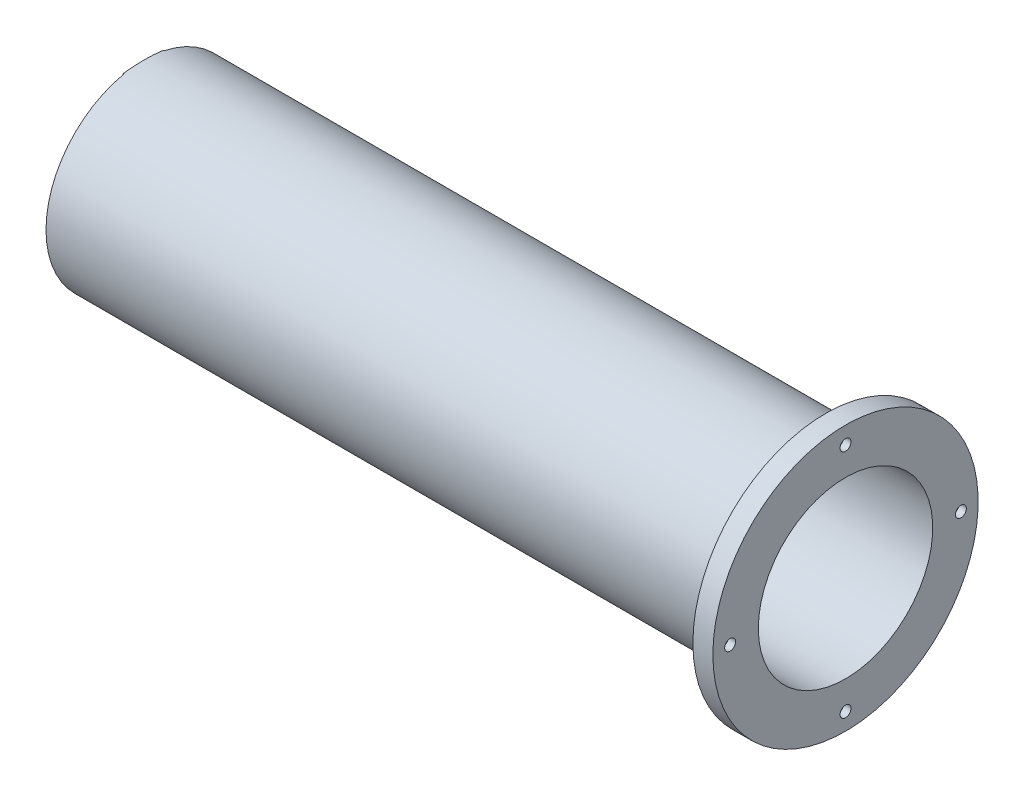
ISO-10303-21;
HEADER;
FILE_DESCRIPTION(('STEP AP214'),'2;1');
FILE_NAME('part.step','',(''),(''),'','','');
FILE_SCHEMA(('AUTOMOTIVE_DESIGN { 1 0 10303 214 1 1 1 1 }'));
ENDSEC;
DATA;
#1=APPLICATION_CONTEXT('core data for automotive mechanical design processes');
#2=APPLICATION_PROTOCOL_DEFINITION('international standard','automotive_design',2000,#1);
#3=PRODUCT_CONTEXT('',#1,'mechanical');
#4=PRODUCT('Part','Part','',(#3));
#5=PRODUCT_RELATED_PRODUCT_CATEGORY('part','',(#4));
#6=PRODUCT_DEFINITION_FORMATION('','',#4);
#7=PRODUCT_DEFINITION_CONTEXT('part definition',#1,'design');
#8=PRODUCT_DEFINITION('design','',#6,#7);
#9=PRODUCT_DEFINITION_SHAPE('','',#8);
#10=(LENGTH_UNIT() NAMED_UNIT(*) SI_UNIT(.MILLI.,.METRE.));
#11=(NAMED_UNIT(*) PLANE_ANGLE_UNIT() SI_UNIT($,.RADIAN.));
#12=(NAMED_UNIT(*) SI_UNIT($,.STERADIAN.) SOLID_ANGLE_UNIT());
#13=UNCERTAINTY_MEASURE_WITH_UNIT(LENGTH_MEASURE(1.E-05),#10,'distance_accuracy_value','');
#14=(GEOMETRIC_REPRESENTATION_CONTEXT(3) GLOBAL_UNCERTAINTY_ASSIGNED_CONTEXT((#13)) GLOBAL_UNIT_ASSIGNED_CONTEXT((#10,
#11,#12)) REPRESENTATION_CONTEXT('',''));
#15=CARTESIAN_POINT('',(0.,0.,0.));
#16=DIRECTION('',(0.,0.,1.));
#17=DIRECTION('',(1.,0.,0.));
#18=AXIS2_PLACEMENT_3D('',#15,#16,#17);
#19=CARTESIAN_POINT('',(-63.8345304131553,0.,0.));
#20=DIRECTION('',(1.,0.,0.));
#21=DIRECTION('',(0.,0.,-1.));
#22=AXIS2_PLACEMENT_3D('',#19,#20,#21);
#23=PLANE('',#22);
#24=DIRECTION('',(0.,-1.,0.));
#25=VECTOR('',#24,1.);
#26=CARTESIAN_POINT('',(-63.8345304131553,0.,-5.5));
#27=LINE('',#26,#25);
#28=CARTESIAN_POINT('',(-63.8345304131553,26.4338797757726,-5.5));
#29=VERTEX_POINT('',#28);
#30=CARTESIAN_POINT('',(-63.8345304131553,-26.4338797757726,-5.5));
#31=VERTEX_POINT('',#30);
#32=EDGE_CURVE('E224',#29,#31,#27,.T.);
#33=ORIENTED_EDGE('',*,*,#32,.F.);
#34=CARTESIAN_POINT('',(-63.8345304131553,0.,0.));
#35=DIRECTION('',(-1.,0.,0.));
#36=DIRECTION('',(0.,0.,1.));
#37=AXIS2_PLACEMENT_3D('',#34,#35,#36);
#38=CIRCLE('',#37,27.);
#39=EDGE_CURVE('E11',#29,#31,#38,.T.);
#40=ORIENTED_EDGE('',*,*,#39,.T.);
#41=EDGE_LOOP('',(#33,#40));
#42=FACE_BOUND('',#41,.T.);
#43=ADVANCED_FACE('F42',(#42),#23,.F.);
#44=CARTESIAN_POINT('',(-63.8345304131553,-26.4338797757726,5.5));
#45=VERTEX_POINT('',#44);
#46=CARTESIAN_POINT('',(-63.8345304131553,26.4338797757726,5.5));
#47=VERTEX_POINT('',#46);
#48=EDGE_CURVE('E52',#45,#47,#38,.T.);
#49=ORIENTED_EDGE('',*,*,#48,.T.);
#50=DIRECTION('',(0.,-1.,0.));
#51=VECTOR('',#50,1.);
#52=CARTESIAN_POINT('',(-63.8345304131553,0.,5.5));
#53=LINE('',#52,#51);
#54=EDGE_CURVE('E102',#47,#45,#53,.T.);
#55=ORIENTED_EDGE('',*,*,#54,.T.);
#56=EDGE_LOOP('',(#49,#55));
#57=FACE_BOUND('',#56,.T.);
#58=ADVANCED_FACE('F44',(#57),#23,.F.);
#59=CARTESIAN_POINT('',(-88.99,0.,0.));
#60=DIRECTION('',(-1.,0.,0.));
#61=DIRECTION('',(0.,0.,1.));
#62=AXIS2_PLACEMENT_3D('',#59,#60,#61);
#63=CYLINDRICAL_SURFACE('',#62,27.);
#64=CARTESIAN_POINT('',(-73.8345304131553,0.,0.));
#65=DIRECTION('',(-0.937748760723704,0.347314355823594,0.));
#66=DIRECTION('',(0.347314355823594,0.937748760723704,0.));
#67=AXIS2_PLACEMENT_3D('',#64,#65,#66);
#68=ELLIPSE('',#67,28.7923600977759,27.);
#69=CARTESIAN_POINT('',(-64.0442045702766,26.4338797757726,-5.5));
#70=VERTEX_POINT('',#69);
#71=CARTESIAN_POINT('',(-64.0442045702766,26.4338797757726,5.5));
#72=VERTEX_POINT('',#71);
#73=EDGE_CURVE('E97',#70,#72,#68,.F.);
#74=ORIENTED_EDGE('',*,*,#73,.T.);
#75=DIRECTION('',(1.,0.,0.));
#76=VECTOR('',#75,1.);
#77=CARTESIAN_POINT('',(-74.8345304131553,26.4338797757726,5.5));
#78=LINE('',#77,#76);
#79=EDGE_CURVE('E92',#72,#47,#78,.T.);
#80=ORIENTED_EDGE('',*,*,#79,.T.);
#81=ORIENTED_EDGE('',*,*,#48,.F.);
#82=DIRECTION('',(1.,0.,0.));
#83=VECTOR('',#82,1.);
#84=CARTESIAN_POINT('',(-74.8345304131553,-26.4338797757726,5.5));
#85=LINE('',#84,#83);
#86=CARTESIAN_POINT('',(-64.0442045702766,-26.4338797757726,5.5));
#87=VERTEX_POINT('',#86);
#88=EDGE_CURVE('E60',#45,#87,#85,.F.);
#89=ORIENTED_EDGE('',*,*,#88,.T.);
#90=CARTESIAN_POINT('',(-73.8345304131553,0.,0.));
#91=DIRECTION('',(-0.937748760723704,-0.347314355823594,0.));
#92=DIRECTION('',(0.347314355823594,-0.937748760723704,0.));
#93=AXIS2_PLACEMENT_3D('',#90,#91,#92);
#94=ELLIPSE('',#93,28.7923600977759,27.);
#95=CARTESIAN_POINT('',(-64.0442045702766,-26.4338797757726,-5.5));
#96=VERTEX_POINT('',#95);
#97=EDGE_CURVE('E67',#87,#96,#94,.F.);
#98=ORIENTED_EDGE('',*,*,#97,.T.);
#99=DIRECTION('',(1.,0.,0.));
#100=VECTOR('',#99,1.);
#101=CARTESIAN_POINT('',(-74.8345304131553,-26.4338797757726,-5.5));
#102=LINE('',#101,#100);
#103=EDGE_CURVE('E232',#31,#96,#102,.F.);
#104=ORIENTED_EDGE('',*,*,#103,.F.);
#105=ORIENTED_EDGE('',*,*,#39,.F.);
#106=DIRECTION('',(1.,0.,0.));
#107=VECTOR('',#106,1.);
#108=CARTESIAN_POINT('',(-74.8345304131553,26.4338797757726,-5.5));
#109=LINE('',#108,#107);
#110=EDGE_CURVE('E231',#70,#29,#109,.T.);
#111=ORIENTED_EDGE('',*,*,#110,.F.);
#112=EDGE_LOOP('',(#74,#80,#81,#89,#98,#104,#105,#111));
#113=FACE_BOUND('',#112,.T.);
#114=CARTESIAN_POINT('',(123.665469586845,0.,0.));
#115=DIRECTION('',(-1.,0.,0.));
#116=DIRECTION('',(0.,0.,1.));
#117=AXIS2_PLACEMENT_3D('',#114,#115,#116);
#118=CIRCLE('',#117,27.);
#119=CARTESIAN_POINT('',(123.665469586845,0.,27.));
#120=VERTEX_POINT('',#119);
#121=EDGE_CURVE('E111',#120,#120,#118,.T.);
#122=ORIENTED_EDGE('',*,*,#121,.T.);
#123=EDGE_LOOP('',(#122));
#124=FACE_BOUND('',#123,.T.);
#125=ADVANCED_FACE('F93',(#113,#124),#63,.T.);
#126=CARTESIAN_POINT('',(123.665469586845,36.5,0.));
#127=DIRECTION('',(1.,0.,0.));
#128=DIRECTION('',(0.,0.,-1.));
#129=AXIS2_PLACEMENT_3D('',#126,#127,#128);
#130=PLANE('',#129);
#131=CARTESIAN_POINT('',(123.665469586845,-1.10854532508269E-13,-31.75));
#132=DIRECTION('',(-1.,0.,0.));
#133=DIRECTION('',(0.,1.,0.));
#134=AXIS2_PLACEMENT_3D('',#131,#132,#133);
#135=CIRCLE('',#134,3.25);
#136=CARTESIAN_POINT('',(123.665469586845,3.24999999999989,-31.75));
#137=VERTEX_POINT('',#136);
#138=EDGE_CURVE('E254',#137,#137,#135,.T.);
#139=ORIENTED_EDGE('',*,*,#138,.F.);
#140=EDGE_LOOP('',(#139));
#141=FACE_BOUND('',#140,.T.);
#142=CARTESIAN_POINT('',(123.665469586845,-31.75,0.));
#143=DIRECTION('',(-1.,0.,0.));
#144=DIRECTION('',(0.,0.,-1.));
#145=AXIS2_PLACEMENT_3D('',#142,#143,#144);
#146=CIRCLE('',#145,3.25);
#147=CARTESIAN_POINT('',(123.665469586845,-31.75,-3.25));
#148=VERTEX_POINT('',#147);
#149=EDGE_CURVE('E146',#148,#148,#146,.T.);
#150=ORIENTED_EDGE('',*,*,#149,.F.);
#151=EDGE_LOOP('',(#150));
#152=FACE_BOUND('',#151,.T.);
#153=CARTESIAN_POINT('',(123.665469586845,3.32563597524808E-13,31.75));
#154=DIRECTION('',(-1.,0.,0.));
#155=DIRECTION('',(0.,-1.,0.));
#156=AXIS2_PLACEMENT_3D('',#153,#154,#155);
#157=CIRCLE('',#156,3.25);
#158=CARTESIAN_POINT('',(123.665469586845,-3.24999999999967,31.75));
#159=VERTEX_POINT('',#158);
#160=EDGE_CURVE('E135',#159,#159,#157,.T.);
#161=ORIENTED_EDGE('',*,*,#160,.F.);
#162=EDGE_LOOP('',(#161));
#163=FACE_BOUND('',#162,.T.);
#164=CARTESIAN_POINT('',(123.665469586845,31.75,0.));
#165=DIRECTION('',(-1.,0.,0.));
#166=DIRECTION('',(0.,0.,1.));
#167=AXIS2_PLACEMENT_3D('',#164,#165,#166);
#168=CIRCLE('',#167,3.25);
#169=CARTESIAN_POINT('',(123.665469586845,31.75,3.25));
#170=VERTEX_POINT('',#169);
#171=EDGE_CURVE('E122',#170,#170,#168,.T.);
#172=ORIENTED_EDGE('',*,*,#171,.F.);
#173=EDGE_LOOP('',(#172));
#174=FACE_BOUND('',#173,.T.);
#175=ORIENTED_EDGE('',*,*,#121,.F.);
#176=EDGE_LOOP('',(#175));
#177=FACE_BOUND('',#176,.T.);
#178=CARTESIAN_POINT('',(123.665469586845,0.,0.));
#179=DIRECTION('',(-1.,0.,0.));
#180=DIRECTION('',(0.,0.,1.));
#181=AXIS2_PLACEMENT_3D('',#178,#179,#180);
#182=CIRCLE('',#181,36.5);
#183=CARTESIAN_POINT('',(123.665469586845,0.,36.5));
#184=VERTEX_POINT('',#183);
#185=EDGE_CURVE('E114',#184,#184,#182,.T.);
#186=ORIENTED_EDGE('',*,*,#185,.T.);
#187=EDGE_LOOP('',(#186));
#188=FACE_BOUND('',#187,.T.);
#189=ADVANCED_FACE('F180',(#141,#152,#163,#174,#177,#188),#130,.F.);
#190=CARTESIAN_POINT('',(-88.99,0.,0.));
#191=DIRECTION('',(-1.,0.,0.));
#192=DIRECTION('',(0.,0.,1.));
#193=AXIS2_PLACEMENT_3D('',#190,#191,#192);
#194=CYLINDRICAL_SURFACE('',#193,36.5);
#195=ORIENTED_EDGE('',*,*,#185,.F.);
#196=EDGE_LOOP('',(#195));
#197=FACE_BOUND('',#196,.T.);
#198=CARTESIAN_POINT('',(129.165469586845,0.,0.));
#199=DIRECTION('',(-1.,0.,0.));
#200=DIRECTION('',(0.,0.,1.));
#201=AXIS2_PLACEMENT_3D('',#198,#199,#200);
#202=CIRCLE('',#201,36.5);
#203=CARTESIAN_POINT('',(129.165469586845,0.,36.5));
#204=VERTEX_POINT('',#203);
#205=EDGE_CURVE('E173',#204,#204,#202,.T.);
#206=ORIENTED_EDGE('',*,*,#205,.T.);
#207=EDGE_LOOP('',(#206));
#208=FACE_BOUND('',#207,.T.);
#209=ADVANCED_FACE('F182',(#197,#208),#194,.T.);
#210=CARTESIAN_POINT('',(129.165469586845,24.,0.));
#211=DIRECTION('',(-1.,0.,0.));
#212=DIRECTION('',(0.,0.,1.));
#213=AXIS2_PLACEMENT_3D('',#210,#211,#212);
#214=PLANE('',#213);
#215=CARTESIAN_POINT('',(129.165469586845,-1.10854532508269E-13,-31.75));
#216=DIRECTION('',(-1.,0.,0.));
#217=DIRECTION('',(0.,1.,0.));
#218=AXIS2_PLACEMENT_3D('',#215,#216,#217);
#219=CIRCLE('',#218,1.5);
#220=CARTESIAN_POINT('',(129.165469586845,1.49999999999989,-31.75));
#221=VERTEX_POINT('',#220);
#222=EDGE_CURVE('E128',#221,#221,#219,.T.);
#223=ORIENTED_EDGE('',*,*,#222,.T.);
#224=EDGE_LOOP('',(#223));
#225=FACE_BOUND('',#224,.T.);
#226=CARTESIAN_POINT('',(129.165469586845,-31.75,0.));
#227=DIRECTION('',(-1.,0.,0.));
#228=DIRECTION('',(0.,0.,-1.));
#229=AXIS2_PLACEMENT_3D('',#226,#227,#228);
#230=CIRCLE('',#229,1.5);
#231=CARTESIAN_POINT('',(129.165469586845,-31.75,-1.5));
#232=VERTEX_POINT('',#231);
#233=EDGE_CURVE('E240',#232,#232,#230,.T.);
#234=ORIENTED_EDGE('',*,*,#233,.T.);
#235=EDGE_LOOP('',(#234));
#236=FACE_BOUND('',#235,.T.);
#237=CARTESIAN_POINT('',(129.165469586845,3.32563597524808E-13,31.75));
#238=DIRECTION('',(-1.,0.,0.));
#239=DIRECTION('',(0.,-1.,0.));
#240=AXIS2_PLACEMENT_3D('',#237,#238,#239);
#241=CIRCLE('',#240,1.5);
#242=CARTESIAN_POINT('',(129.165469586845,-1.49999999999967,31.75));
#243=VERTEX_POINT('',#242);
#244=EDGE_CURVE('E235',#243,#243,#241,.T.);
#245=ORIENTED_EDGE('',*,*,#244,.T.);
#246=EDGE_LOOP('',(#245));
#247=FACE_BOUND('',#246,.T.);
#248=CARTESIAN_POINT('',(129.165469586845,31.75,0.));
#249=DIRECTION('',(-1.,0.,0.));
#250=DIRECTION('',(0.,0.,1.));
#251=AXIS2_PLACEMENT_3D('',#248,#249,#250);
#252=CIRCLE('',#251,1.5);
#253=CARTESIAN_POINT('',(129.165469586845,31.75,1.5));
#254=VERTEX_POINT('',#253);
#255=EDGE_CURVE('E123',#254,#254,#252,.T.);
#256=ORIENTED_EDGE('',*,*,#255,.T.);
#257=EDGE_LOOP('',(#256));
#258=FACE_BOUND('',#257,.T.);
#259=ORIENTED_EDGE('',*,*,#205,.F.);
#260=EDGE_LOOP('',(#259));
#261=FACE_BOUND('',#260,.T.);
#262=CARTESIAN_POINT('',(129.165469586845,0.,0.));
#263=DIRECTION('',(-1.,0.,0.));
#264=DIRECTION('',(0.,0.,1.));
#265=AXIS2_PLACEMENT_3D('',#262,#263,#264);
#266=CIRCLE('',#265,24.);
#267=CARTESIAN_POINT('',(129.165469586845,0.,24.));
#268=VERTEX_POINT('',#267);
#269=EDGE_CURVE('E169',#268,#268,#266,.T.);
#270=ORIENTED_EDGE('',*,*,#269,.T.);
#271=EDGE_LOOP('',(#270));
#272=FACE_BOUND('',#271,.T.);
#273=ADVANCED_FACE('F185',(#225,#236,#247,#258,#261,#272),#214,.F.);
#274=CARTESIAN_POINT('',(-88.99,0.,0.));
#275=DIRECTION('',(-1.,0.,0.));
#276=DIRECTION('',(0.,0.,1.));
#277=AXIS2_PLACEMENT_3D('',#274,#275,#276);
#278=CYLINDRICAL_SURFACE('',#277,24.);
#279=ORIENTED_EDGE('',*,*,#269,.F.);
#280=EDGE_LOOP('',(#279));
#281=FACE_BOUND('',#280,.T.);
#282=CARTESIAN_POINT('',(-55.8345120471635,0.,0.));
#283=DIRECTION('',(-1.,0.,0.));
#284=DIRECTION('',(0.,0.,1.));
#285=AXIS2_PLACEMENT_3D('',#282,#283,#284);
#286=CIRCLE('',#285,24.);
#287=CARTESIAN_POINT('',(-55.8345120471635,0.,24.));
#288=VERTEX_POINT('',#287);
#289=EDGE_CURVE('E165',#288,#288,#286,.T.);
#290=ORIENTED_EDGE('',*,*,#289,.T.);
#291=EDGE_LOOP('',(#290));
#292=FACE_BOUND('',#291,.T.);
#293=ADVANCED_FACE('F191',(#281,#292),#278,.F.);
#294=CARTESIAN_POINT('',(-55.8345304131553,0.,0.));
#295=DIRECTION('',(-1.,0.,0.));
#296=DIRECTION('',(0.,0.,1.));
#297=AXIS2_PLACEMENT_3D('',#294,#295,#296);
#298=TOROIDAL_SURFACE('',#297,19.0000000000337,5.);
#299=ORIENTED_EDGE('',*,*,#289,.F.);
#300=EDGE_LOOP('',(#299));
#301=FACE_BOUND('',#300,.T.);
#302=CARTESIAN_POINT('',(-60.8345304131553,0.,0.));
#303=DIRECTION('',(-1.,0.,0.));
#304=DIRECTION('',(0.,0.,1.));
#305=AXIS2_PLACEMENT_3D('',#302,#303,#304);
#306=CIRCLE('',#305,19.);
#307=CARTESIAN_POINT('',(-60.8345304131553,0.,19.));
#308=VERTEX_POINT('',#307);
#309=EDGE_CURVE('E158',#308,#308,#306,.T.);
#310=ORIENTED_EDGE('',*,*,#309,.T.);
#311=EDGE_LOOP('',(#310));
#312=FACE_BOUND('',#311,.T.);
#313=ADVANCED_FACE('F198',(#301,#312),#298,.F.);
#314=CARTESIAN_POINT('',(-60.8345304131553,0.,0.));
#315=DIRECTION('',(-1.,0.,0.));
#316=DIRECTION('',(0.,0.,1.));
#317=AXIS2_PLACEMENT_3D('',#314,#315,#316);
#318=PLANE('',#317);
#319=ORIENTED_EDGE('',*,*,#309,.F.);
#320=EDGE_LOOP('',(#319));
#321=FACE_BOUND('',#320,.T.);
#322=ADVANCED_FACE('F204',(#321),#318,.F.);
#323=CARTESIAN_POINT('',(127.165469586845,31.75,0.));
#324=DIRECTION('',(-1.,0.,0.));
#325=DIRECTION('',(0.,0.,1.));
#326=AXIS2_PLACEMENT_3D('',#323,#324,#325);
#327=CYLINDRICAL_SURFACE('',#326,3.25);
#328=CARTESIAN_POINT('',(127.165469586845,31.75,0.));
#329=DIRECTION('',(-1.,0.,0.));
#330=DIRECTION('',(0.,0.,1.));
#331=AXIS2_PLACEMENT_3D('',#328,#329,#330);
#332=CIRCLE('',#331,3.25);
#333=CARTESIAN_POINT('',(127.165469586845,31.75,3.25));
#334=VERTEX_POINT('',#333);
#335=EDGE_CURVE('E154',#334,#334,#332,.T.);
#336=ORIENTED_EDGE('',*,*,#335,.F.);
#337=EDGE_LOOP('',(#336));
#338=FACE_BOUND('',#337,.T.);
#339=ORIENTED_EDGE('',*,*,#171,.T.);
#340=EDGE_LOOP('',(#339));
#341=FACE_BOUND('',#340,.T.);
#342=ADVANCED_FACE('F209',(#338,#341),#327,.F.);
#343=CARTESIAN_POINT('',(127.165469586845,31.75,0.));
#344=DIRECTION('',(-1.,0.,0.));
#345=DIRECTION('',(0.,0.,1.));
#346=AXIS2_PLACEMENT_3D('',#343,#344,#345);
#347=PLANE('',#346);
#348=CARTESIAN_POINT('',(127.165469586845,31.75,0.));
#349=DIRECTION('',(-1.,0.,0.));
#350=DIRECTION('',(0.,0.,1.));
#351=AXIS2_PLACEMENT_3D('',#348,#349,#350);
#352=CIRCLE('',#351,1.5);
#353=CARTESIAN_POINT('',(127.165469586845,31.75,1.5));
#354=VERTEX_POINT('',#353);
#355=EDGE_CURVE('E118',#354,#354,#352,.T.);
#356=ORIENTED_EDGE('',*,*,#355,.F.);
#357=EDGE_LOOP('',(#356));
#358=FACE_BOUND('',#357,.T.);
#359=ORIENTED_EDGE('',*,*,#335,.T.);
#360=EDGE_LOOP('',(#359));
#361=FACE_BOUND('',#360,.T.);
#362=ADVANCED_FACE('F215',(#358,#361),#347,.T.);
#363=CARTESIAN_POINT('',(129.165469586845,31.75,0.));
#364=DIRECTION('',(-1.,0.,0.));
#365=DIRECTION('',(0.,0.,1.));
#366=AXIS2_PLACEMENT_3D('',#363,#364,#365);
#367=CYLINDRICAL_SURFACE('',#366,1.5);
#368=ORIENTED_EDGE('',*,*,#355,.T.);
#369=EDGE_LOOP('',(#368));
#370=FACE_BOUND('',#369,.T.);
#371=ORIENTED_EDGE('',*,*,#255,.F.);
#372=EDGE_LOOP('',(#371));
#373=FACE_BOUND('',#372,.T.);
#374=ADVANCED_FACE('F352',(#370,#373),#367,.F.);
#375=CARTESIAN_POINT('',(127.165469586845,3.32563597524808E-13,31.75));
#376=DIRECTION('',(-1.,0.,0.));
#377=DIRECTION('',(0.,0.,1.));
#378=AXIS2_PLACEMENT_3D('',#375,#376,#377);
#379=CYLINDRICAL_SURFACE('',#378,3.25);
#380=CARTESIAN_POINT('',(127.165469586845,3.32563597524808E-13,31.75));
#381=DIRECTION('',(-1.,0.,0.));
#382=DIRECTION('',(0.,-1.,0.));
#383=AXIS2_PLACEMENT_3D('',#380,#381,#382);
#384=CIRCLE('',#383,3.25);
#385=CARTESIAN_POINT('',(127.165469586845,-3.24999999999967,31.75));
#386=VERTEX_POINT('',#385);
#387=EDGE_CURVE('E140',#386,#386,#384,.T.);
#388=ORIENTED_EDGE('',*,*,#387,.F.);
#389=EDGE_LOOP('',(#388));
#390=FACE_BOUND('',#389,.T.);
#391=ORIENTED_EDGE('',*,*,#160,.T.);
#392=EDGE_LOOP('',(#391));
#393=FACE_BOUND('',#392,.T.);
#394=ADVANCED_FACE('F361',(#390,#393),#379,.F.);
#395=CARTESIAN_POINT('',(127.165469586845,3.32563597524808E-13,31.75));
#396=DIRECTION('',(-1.,0.,0.));
#397=DIRECTION('',(0.,-1.,0.));
#398=AXIS2_PLACEMENT_3D('',#395,#396,#397);
#399=PLANE('',#398);
#400=CARTESIAN_POINT('',(127.165469586845,3.32563597524808E-13,31.75));
#401=DIRECTION('',(-1.,0.,0.));
#402=DIRECTION('',(0.,0.,1.));
#403=AXIS2_PLACEMENT_3D('',#400,#401,#402);
#404=CIRCLE('',#403,1.5);
#405=CARTESIAN_POINT('',(127.165469586845,3.32563597524808E-13,33.25));
#406=VERTEX_POINT('',#405);
#407=EDGE_CURVE('E46',#406,#406,#404,.T.);
#408=ORIENTED_EDGE('',*,*,#407,.F.);
#409=EDGE_LOOP('',(#408));
#410=FACE_BOUND('',#409,.T.);
#411=ORIENTED_EDGE('',*,*,#387,.T.);
#412=EDGE_LOOP('',(#411));
#413=FACE_BOUND('',#412,.T.);
#414=ADVANCED_FACE('F370',(#410,#413),#399,.T.);
#415=CARTESIAN_POINT('',(127.165469586845,-31.75,0.));
#416=DIRECTION('',(-1.,0.,0.));
#417=DIRECTION('',(0.,0.,1.));
#418=AXIS2_PLACEMENT_3D('',#415,#416,#417);
#419=CYLINDRICAL_SURFACE('',#418,3.25);
#420=CARTESIAN_POINT('',(127.165469586845,-31.75,0.));
#421=DIRECTION('',(-1.,0.,0.));
#422=DIRECTION('',(0.,0.,-1.));
#423=AXIS2_PLACEMENT_3D('',#420,#421,#422);
#424=CIRCLE('',#423,3.25);
#425=CARTESIAN_POINT('',(127.165469586845,-31.75,-3.25));
#426=VERTEX_POINT('',#425);
#427=EDGE_CURVE('E258',#426,#426,#424,.T.);
#428=ORIENTED_EDGE('',*,*,#427,.F.);
#429=EDGE_LOOP('',(#428));
#430=FACE_BOUND('',#429,.T.);
#431=ORIENTED_EDGE('',*,*,#149,.T.);
#432=EDGE_LOOP('',(#431));
#433=FACE_BOUND('',#432,.T.);
#434=ADVANCED_FACE('F265',(#430,#433),#419,.F.);
#435=CARTESIAN_POINT('',(127.165469586845,-31.75,0.));
#436=DIRECTION('',(-1.,0.,0.));
#437=DIRECTION('',(0.,0.,-1.));
#438=AXIS2_PLACEMENT_3D('',#435,#436,#437);
#439=PLANE('',#438);
#440=CARTESIAN_POINT('',(127.165469586845,-31.75,0.));
#441=DIRECTION('',(-1.,0.,0.));
#442=DIRECTION('',(0.,0.,1.));
#443=AXIS2_PLACEMENT_3D('',#440,#441,#442);
#444=CIRCLE('',#443,1.5);
#445=CARTESIAN_POINT('',(127.165469586845,-31.75,1.5));
#446=VERTEX_POINT('',#445);
#447=EDGE_CURVE('E127',#446,#446,#444,.T.);
#448=ORIENTED_EDGE('',*,*,#447,.F.);
#449=EDGE_LOOP('',(#448));
#450=FACE_BOUND('',#449,.T.);
#451=ORIENTED_EDGE('',*,*,#427,.T.);
#452=EDGE_LOOP('',(#451));
#453=FACE_BOUND('',#452,.T.);
#454=ADVANCED_FACE('F387',(#450,#453),#439,.T.);
#455=CARTESIAN_POINT('',(127.165469586845,-1.10854532508269E-13,-31.75));
#456=DIRECTION('',(-1.,0.,0.));
#457=DIRECTION('',(0.,0.,1.));
#458=AXIS2_PLACEMENT_3D('',#455,#456,#457);
#459=CYLINDRICAL_SURFACE('',#458,3.25);
#460=CARTESIAN_POINT('',(127.165469586845,-1.10854532508269E-13,-31.75));
#461=DIRECTION('',(-1.,0.,0.));
#462=DIRECTION('',(0.,1.,0.));
#463=AXIS2_PLACEMENT_3D('',#460,#461,#462);
#464=CIRCLE('',#463,3.25);
#465=CARTESIAN_POINT('',(127.165469586845,3.24999999999989,-31.75));
#466=VERTEX_POINT('',#465);
#467=EDGE_CURVE('E153',#466,#466,#464,.T.);
#468=ORIENTED_EDGE('',*,*,#467,.F.);
#469=EDGE_LOOP('',(#468));
#470=FACE_BOUND('',#469,.T.);
#471=ORIENTED_EDGE('',*,*,#138,.T.);
#472=EDGE_LOOP('',(#471));
#473=FACE_BOUND('',#472,.T.);
#474=ADVANCED_FACE('F396',(#470,#473),#459,.F.);
#475=CARTESIAN_POINT('',(127.165469586845,-1.10854532508269E-13,-31.75));
#476=DIRECTION('',(-1.,0.,0.));
#477=DIRECTION('',(0.,1.,0.));
#478=AXIS2_PLACEMENT_3D('',#475,#476,#477);
#479=PLANE('',#478);
#480=CARTESIAN_POINT('',(127.165469586845,-1.10854532508269E-13,-31.75));
#481=DIRECTION('',(-1.,0.,0.));
#482=DIRECTION('',(0.,0.,1.));
#483=AXIS2_PLACEMENT_3D('',#480,#481,#482);
#484=CIRCLE('',#483,1.5);
#485=CARTESIAN_POINT('',(127.165469586845,-1.10854532508269E-13,-30.25));
#486=VERTEX_POINT('',#485);
#487=EDGE_CURVE('E124',#486,#486,#484,.T.);
#488=ORIENTED_EDGE('',*,*,#487,.F.);
#489=EDGE_LOOP('',(#488));
#490=FACE_BOUND('',#489,.T.);
#491=ORIENTED_EDGE('',*,*,#467,.T.);
#492=EDGE_LOOP('',(#491));
#493=FACE_BOUND('',#492,.T.);
#494=ADVANCED_FACE('F405',(#490,#493),#479,.T.);
#495=CARTESIAN_POINT('',(129.165469586845,-1.10854532508269E-13,-31.75));
#496=DIRECTION('',(-1.,0.,0.));
#497=DIRECTION('',(0.,0.,1.));
#498=AXIS2_PLACEMENT_3D('',#495,#496,#497);
#499=CYLINDRICAL_SURFACE('',#498,1.5);
#500=ORIENTED_EDGE('',*,*,#487,.T.);
#501=EDGE_LOOP('',(#500));
#502=FACE_BOUND('',#501,.T.);
#503=ORIENTED_EDGE('',*,*,#222,.F.);
#504=EDGE_LOOP('',(#503));
#505=FACE_BOUND('',#504,.T.);
#506=ADVANCED_FACE('F421',(#502,#505),#499,.F.);
#507=CARTESIAN_POINT('',(129.165469586845,-31.75,0.));
#508=DIRECTION('',(-1.,0.,0.));
#509=DIRECTION('',(0.,0.,1.));
#510=AXIS2_PLACEMENT_3D('',#507,#508,#509);
#511=CYLINDRICAL_SURFACE('',#510,1.5);
#512=ORIENTED_EDGE('',*,*,#447,.T.);
#513=EDGE_LOOP('',(#512));
#514=FACE_BOUND('',#513,.T.);
#515=ORIENTED_EDGE('',*,*,#233,.F.);
#516=EDGE_LOOP('',(#515));
#517=FACE_BOUND('',#516,.T.);
#518=ADVANCED_FACE('F414',(#514,#517),#511,.F.);
#519=CARTESIAN_POINT('',(129.165469586845,3.32563597524808E-13,31.75));
#520=DIRECTION('',(-1.,0.,0.));
#521=DIRECTION('',(0.,0.,1.));
#522=AXIS2_PLACEMENT_3D('',#519,#520,#521);
#523=CYLINDRICAL_SURFACE('',#522,1.5);
#524=ORIENTED_EDGE('',*,*,#407,.T.);
#525=EDGE_LOOP('',(#524));
#526=FACE_BOUND('',#525,.T.);
#527=ORIENTED_EDGE('',*,*,#244,.F.);
#528=EDGE_LOOP('',(#527));
#529=FACE_BOUND('',#528,.T.);
#530=ADVANCED_FACE('F285',(#526,#529),#523,.F.);
#531=CARTESIAN_POINT('',(-64.9280731859955,24.0474345133317,5.5));
#532=DIRECTION('',(-0.937748760723704,0.347314355823594,0.));
#533=DIRECTION('',(-0.347314355823594,-0.937748760723704,0.));
#534=AXIS2_PLACEMENT_3D('',#531,#532,#533);
#535=PLANE('',#534);
#536=DIRECTION('',(0.347314355823594,0.937748760723704,0.));
#537=VECTOR('',#536,1.);
#538=CARTESIAN_POINT('',(-64.9280731859955,24.0474345133317,5.5));
#539=LINE('',#538,#537);
#540=CARTESIAN_POINT('',(-73.8345304131553,0.,5.5));
#541=VERTEX_POINT('',#540);
#542=EDGE_CURVE('E555',#541,#72,#539,.T.);
#543=ORIENTED_EDGE('',*,*,#542,.T.);
#544=ORIENTED_EDGE('',*,*,#73,.F.);
#545=DIRECTION('',(0.347314355823594,0.937748760723704,0.));
#546=VECTOR('',#545,1.);
#547=CARTESIAN_POINT('',(-64.9280731859955,24.0474345133317,-5.5));
#548=LINE('',#547,#546);
#549=CARTESIAN_POINT('',(-73.8345304131553,0.,-5.5));
#550=VERTEX_POINT('',#549);
#551=EDGE_CURVE('E541',#550,#70,#548,.T.);
#552=ORIENTED_EDGE('',*,*,#551,.F.);
#553=DIRECTION('',(0.,0.,-1.));
#554=VECTOR('',#553,1.);
#555=CARTESIAN_POINT('',(-73.8345304131553,0.,5.5));
#556=LINE('',#555,#554);
#557=EDGE_CURVE('E107',#541,#550,#556,.T.);
#558=ORIENTED_EDGE('',*,*,#557,.F.);
#559=EDGE_LOOP('',(#543,#544,#552,#558));
#560=FACE_BOUND('',#559,.T.);
#561=ADVANCED_FACE('F282',(#560),#535,.T.);
#562=CARTESIAN_POINT('',(-64.9280731859955,-24.0474345133316,5.5));
#563=DIRECTION('',(-0.937748760723704,-0.347314355823594,0.));
#564=DIRECTION('',(0.347314355823594,-0.937748760723704,0.));
#565=AXIS2_PLACEMENT_3D('',#562,#563,#564);
#566=PLANE('',#565);
#567=ORIENTED_EDGE('',*,*,#97,.F.);
#568=DIRECTION('',(-0.347314355823594,0.937748760723704,0.));
#569=VECTOR('',#568,1.);
#570=CARTESIAN_POINT('',(-64.9280731859955,-24.0474345133316,5.5));
#571=LINE('',#570,#569);
#572=EDGE_CURVE('E108',#87,#541,#571,.T.);
#573=ORIENTED_EDGE('',*,*,#572,.T.);
#574=ORIENTED_EDGE('',*,*,#557,.T.);
#575=DIRECTION('',(-0.347314355823594,0.937748760723704,0.));
#576=VECTOR('',#575,1.);
#577=CARTESIAN_POINT('',(-64.9280731859955,-24.0474345133316,-5.5));
#578=LINE('',#577,#576);
#579=EDGE_CURVE('E229',#96,#550,#578,.T.);
#580=ORIENTED_EDGE('',*,*,#579,.F.);
#581=EDGE_LOOP('',(#567,#573,#574,#580));
#582=FACE_BOUND('',#581,.T.);
#583=ADVANCED_FACE('F284',(#582),#566,.T.);
#584=CARTESIAN_POINT('',(-68.8345304131553,0.,5.5));
#585=DIRECTION('',(0.,0.,-1.));
#586=DIRECTION('',(-1.,0.,0.));
#587=AXIS2_PLACEMENT_3D('',#584,#585,#586);
#588=CYLINDRICAL_SURFACE('',#587,2.);
#589=CARTESIAN_POINT('',(-68.8345304131553,0.,5.5));
#590=DIRECTION('',(0.,0.,1.));
#591=DIRECTION('',(1.,0.,0.));
#592=AXIS2_PLACEMENT_3D('',#589,#590,#591);
#593=CIRCLE('',#592,2.);
#594=CARTESIAN_POINT('',(-66.8345304131553,0.,5.5));
#595=VERTEX_POINT('',#594);
#596=EDGE_CURVE('E228',#595,#595,#593,.T.);
#597=ORIENTED_EDGE('',*,*,#596,.T.);
#598=EDGE_LOOP('',(#597));
#599=FACE_BOUND('',#598,.T.);
#600=CARTESIAN_POINT('',(-68.8345304131553,0.,-5.5));
#601=DIRECTION('',(0.,0.,1.));
#602=DIRECTION('',(1.,0.,0.));
#603=AXIS2_PLACEMENT_3D('',#600,#601,#602);
#604=CIRCLE('',#603,2.);
#605=CARTESIAN_POINT('',(-66.8345304131553,0.,-5.5));
#606=VERTEX_POINT('',#605);
#607=EDGE_CURVE('E538',#606,#606,#604,.T.);
#608=ORIENTED_EDGE('',*,*,#607,.F.);
#609=EDGE_LOOP('',(#608));
#610=FACE_BOUND('',#609,.T.);
#611=ADVANCED_FACE('F292',(#599,#610),#588,.F.);
#612=CARTESIAN_POINT('',(0.,0.,5.5));
#613=DIRECTION('',(0.,0.,1.));
#614=DIRECTION('',(1.,0.,0.));
#615=AXIS2_PLACEMENT_3D('',#612,#613,#614);
#616=PLANE('',#615);
#617=ORIENTED_EDGE('',*,*,#88,.F.);
#618=ORIENTED_EDGE('',*,*,#54,.F.);
#619=ORIENTED_EDGE('',*,*,#79,.F.);
#620=ORIENTED_EDGE('',*,*,#542,.F.);
#621=ORIENTED_EDGE('',*,*,#572,.F.);
#622=EDGE_LOOP('',(#617,#618,#619,#620,#621));
#623=FACE_BOUND('',#622,.T.);
#624=ORIENTED_EDGE('',*,*,#596,.F.);
#625=EDGE_LOOP('',(#624));
#626=FACE_BOUND('',#625,.T.);
#627=ADVANCED_FACE('F103',(#623,#626),#616,.T.);
#628=CARTESIAN_POINT('',(0.,0.,-5.5));
#629=DIRECTION('',(0.,0.,1.));
#630=DIRECTION('',(1.,0.,0.));
#631=AXIS2_PLACEMENT_3D('',#628,#629,#630);
#632=PLANE('',#631);
#633=ORIENTED_EDGE('',*,*,#607,.T.);
#634=EDGE_LOOP('',(#633));
#635=FACE_BOUND('',#634,.T.);
#636=ORIENTED_EDGE('',*,*,#32,.T.);
#637=ORIENTED_EDGE('',*,*,#103,.T.);
#638=ORIENTED_EDGE('',*,*,#579,.T.);
#639=ORIENTED_EDGE('',*,*,#551,.T.);
#640=ORIENTED_EDGE('',*,*,#110,.T.);
#641=EDGE_LOOP('',(#636,#637,#638,#639,#640));
#642=FACE_BOUND('',#641,.T.);
#643=ADVANCED_FACE('F305',(#635,#642),#632,.F.);
#644=CLOSED_SHELL('',(#43,#58,#125,#189,#209,#273,#293,#313,#322,#342,#362,#374,#394,#414,#434,
#454,#474,#494,#506,#518,#530,#561,#583,#611,#627,#643));
#645=MANIFOLD_SOLID_BREP('B2',#644);
#646=ADVANCED_BREP_SHAPE_REPRESENTATION('',(#18,#645),#14);
#647=SHAPE_DEFINITION_REPRESENTATION(#9,#646);
ENDSEC;
END-ISO-10303-21;
